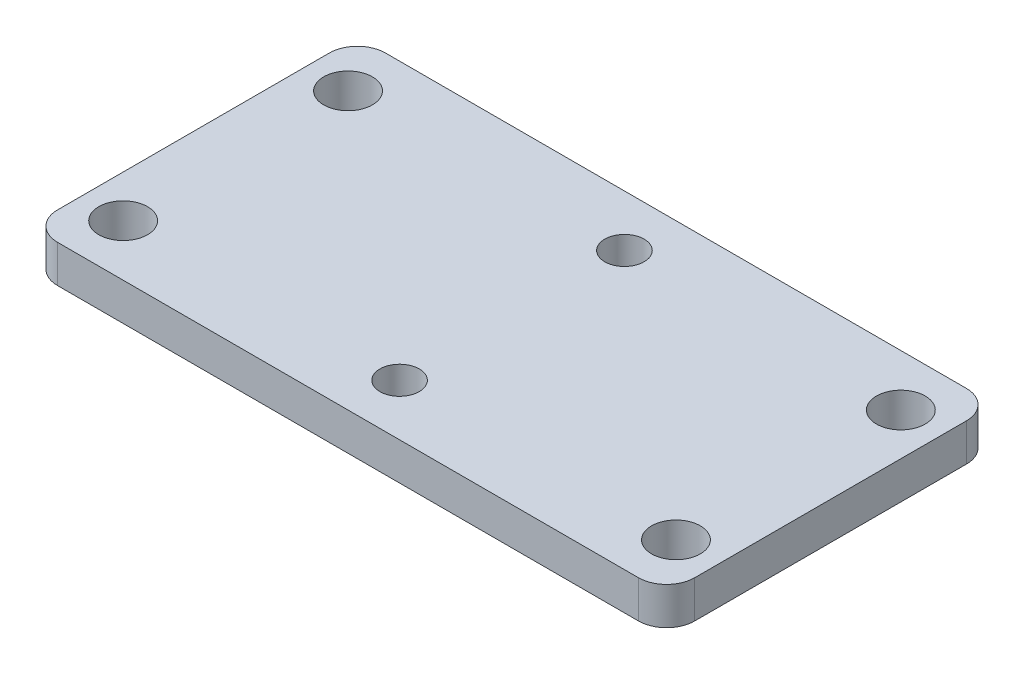
ISO-10303-21;
HEADER;
FILE_DESCRIPTION(('STEP AP214'),'2;1');
FILE_NAME('part.step','',(''),(''),'','','');
FILE_SCHEMA(('AUTOMOTIVE_DESIGN { 1 0 10303 214 1 1 1 1 }'));
ENDSEC;
DATA;
#1=APPLICATION_CONTEXT('core data for automotive mechanical design processes');
#2=APPLICATION_PROTOCOL_DEFINITION('international standard','automotive_design',2000,#1);
#3=PRODUCT_CONTEXT('',#1,'mechanical');
#4=PRODUCT('Part','Part','',(#3));
#5=PRODUCT_RELATED_PRODUCT_CATEGORY('part','',(#4));
#6=PRODUCT_DEFINITION_FORMATION('','',#4);
#7=PRODUCT_DEFINITION_CONTEXT('part definition',#1,'design');
#8=PRODUCT_DEFINITION('design','',#6,#7);
#9=PRODUCT_DEFINITION_SHAPE('','',#8);
#10=(LENGTH_UNIT() NAMED_UNIT(*) SI_UNIT(.MILLI.,.METRE.));
#11=(NAMED_UNIT(*) PLANE_ANGLE_UNIT() SI_UNIT($,.RADIAN.));
#12=(NAMED_UNIT(*) SI_UNIT($,.STERADIAN.) SOLID_ANGLE_UNIT());
#13=UNCERTAINTY_MEASURE_WITH_UNIT(LENGTH_MEASURE(1.E-05),#10,'distance_accuracy_value','');
#14=(GEOMETRIC_REPRESENTATION_CONTEXT(3) GLOBAL_UNCERTAINTY_ASSIGNED_CONTEXT((#13)) GLOBAL_UNIT_ASSIGNED_CONTEXT((#10,
#11,#12)) REPRESENTATION_CONTEXT('',''));
#15=CARTESIAN_POINT('',(0.,0.,0.));
#16=DIRECTION('',(0.,0.,1.));
#17=DIRECTION('',(1.,0.,0.));
#18=AXIS2_PLACEMENT_3D('',#15,#16,#17);
#19=CARTESIAN_POINT('',(34.,4.,17.5));
#20=DIRECTION('',(-1.,0.,0.));
#21=DIRECTION('',(0.,0.,1.));
#22=AXIS2_PLACEMENT_3D('',#19,#20,#21);
#23=PLANE('',#22);
#24=DIRECTION('',(0.,0.,-1.));
#25=VECTOR('',#24,1.);
#26=CARTESIAN_POINT('',(34.,4.,17.5));
#27=LINE('',#26,#25);
#28=CARTESIAN_POINT('',(34.,4.,14.5));
#29=VERTEX_POINT('',#28);
#30=CARTESIAN_POINT('',(34.,4.,-14.5));
#31=VERTEX_POINT('',#30);
#32=EDGE_CURVE('E127',#29,#31,#27,.T.);
#33=ORIENTED_EDGE('',*,*,#32,.F.);
#34=DIRECTION('',(0.,-1.,0.));
#35=VECTOR('',#34,1.);
#36=CARTESIAN_POINT('',(34.,4.,14.5));
#37=LINE('',#36,#35);
#38=CARTESIAN_POINT('',(34.,0.,14.5));
#39=VERTEX_POINT('',#38);
#40=EDGE_CURVE('E112',#29,#39,#37,.T.);
#41=ORIENTED_EDGE('',*,*,#40,.T.);
#42=DIRECTION('',(0.,0.,-1.));
#43=VECTOR('',#42,1.);
#44=CARTESIAN_POINT('',(34.,0.,17.5));
#45=LINE('',#44,#43);
#46=CARTESIAN_POINT('',(34.,0.,-14.5));
#47=VERTEX_POINT('',#46);
#48=EDGE_CURVE('E124',#39,#47,#45,.T.);
#49=ORIENTED_EDGE('',*,*,#48,.T.);
#50=DIRECTION('',(0.,-1.,0.));
#51=VECTOR('',#50,1.);
#52=CARTESIAN_POINT('',(34.,4.,-14.5));
#53=LINE('',#52,#51);
#54=EDGE_CURVE('E129',#47,#31,#53,.F.);
#55=ORIENTED_EDGE('',*,*,#54,.T.);
#56=EDGE_LOOP('',(#33,#41,#49,#55));
#57=FACE_BOUND('',#56,.T.);
#58=ADVANCED_FACE('F43',(#57),#23,.F.);
#59=CARTESIAN_POINT('',(-34.,4.,-17.5));
#60=DIRECTION('',(0.,0.,1.));
#61=DIRECTION('',(1.,0.,0.));
#62=AXIS2_PLACEMENT_3D('',#59,#60,#61);
#63=PLANE('',#62);
#64=DIRECTION('',(-1.,0.,0.));
#65=VECTOR('',#64,1.);
#66=CARTESIAN_POINT('',(-34.,4.,-17.5));
#67=LINE('',#66,#65);
#68=CARTESIAN_POINT('',(31.,4.,-17.5));
#69=VERTEX_POINT('',#68);
#70=CARTESIAN_POINT('',(-31.,4.,-17.5));
#71=VERTEX_POINT('',#70);
#72=EDGE_CURVE('E182',#69,#71,#67,.T.);
#73=ORIENTED_EDGE('',*,*,#72,.F.);
#74=DIRECTION('',(0.,-1.,0.));
#75=VECTOR('',#74,1.);
#76=CARTESIAN_POINT('',(31.,4.,-17.5));
#77=LINE('',#76,#75);
#78=CARTESIAN_POINT('',(31.,0.,-17.5));
#79=VERTEX_POINT('',#78);
#80=EDGE_CURVE('E166',#69,#79,#77,.T.);
#81=ORIENTED_EDGE('',*,*,#80,.T.);
#82=DIRECTION('',(-1.,0.,0.));
#83=VECTOR('',#82,1.);
#84=CARTESIAN_POINT('',(-34.,0.,-17.5));
#85=LINE('',#84,#83);
#86=CARTESIAN_POINT('',(-31.,0.,-17.5));
#87=VERTEX_POINT('',#86);
#88=EDGE_CURVE('E133',#79,#87,#85,.T.);
#89=ORIENTED_EDGE('',*,*,#88,.T.);
#90=DIRECTION('',(0.,-1.,0.));
#91=VECTOR('',#90,1.);
#92=CARTESIAN_POINT('',(-31.,4.,-17.5));
#93=LINE('',#92,#91);
#94=EDGE_CURVE('E164',#87,#71,#93,.F.);
#95=ORIENTED_EDGE('',*,*,#94,.T.);
#96=EDGE_LOOP('',(#73,#81,#89,#95));
#97=FACE_BOUND('',#96,.T.);
#98=ADVANCED_FACE('F244',(#97),#63,.F.);
#99=CARTESIAN_POINT('',(-34.,4.,17.5));
#100=DIRECTION('',(1.,0.,0.));
#101=DIRECTION('',(0.,0.,-1.));
#102=AXIS2_PLACEMENT_3D('',#99,#100,#101);
#103=PLANE('',#102);
#104=DIRECTION('',(0.,0.,1.));
#105=VECTOR('',#104,1.);
#106=CARTESIAN_POINT('',(-34.,0.,17.5));
#107=LINE('',#106,#105);
#108=CARTESIAN_POINT('',(-34.,0.,-14.5));
#109=VERTEX_POINT('',#108);
#110=CARTESIAN_POINT('',(-34.,0.,14.5));
#111=VERTEX_POINT('',#110);
#112=EDGE_CURVE('E137',#109,#111,#107,.T.);
#113=ORIENTED_EDGE('',*,*,#112,.T.);
#114=DIRECTION('',(0.,-1.,0.));
#115=VECTOR('',#114,1.);
#116=CARTESIAN_POINT('',(-34.,4.,14.5));
#117=LINE('',#116,#115);
#118=CARTESIAN_POINT('',(-34.,4.,14.5));
#119=VERTEX_POINT('',#118);
#120=EDGE_CURVE('E11',#111,#119,#117,.F.);
#121=ORIENTED_EDGE('',*,*,#120,.T.);
#122=DIRECTION('',(0.,0.,1.));
#123=VECTOR('',#122,1.);
#124=CARTESIAN_POINT('',(-34.,4.,17.5));
#125=LINE('',#124,#123);
#126=CARTESIAN_POINT('',(-34.,4.,-14.5));
#127=VERTEX_POINT('',#126);
#128=EDGE_CURVE('E172',#127,#119,#125,.T.);
#129=ORIENTED_EDGE('',*,*,#128,.F.);
#130=DIRECTION('',(0.,-1.,0.));
#131=VECTOR('',#130,1.);
#132=CARTESIAN_POINT('',(-34.,4.,-14.5));
#133=LINE('',#132,#131);
#134=EDGE_CURVE('E51',#127,#109,#133,.T.);
#135=ORIENTED_EDGE('',*,*,#134,.T.);
#136=EDGE_LOOP('',(#113,#121,#129,#135));
#137=FACE_BOUND('',#136,.T.);
#138=ADVANCED_FACE('F171',(#137),#103,.F.);
#139=CARTESIAN_POINT('',(-34.,4.,17.5));
#140=DIRECTION('',(0.,0.,-1.));
#141=DIRECTION('',(-1.,0.,0.));
#142=AXIS2_PLACEMENT_3D('',#139,#140,#141);
#143=PLANE('',#142);
#144=DIRECTION('',(1.,0.,0.));
#145=VECTOR('',#144,1.);
#146=CARTESIAN_POINT('',(-34.,0.,17.5));
#147=LINE('',#146,#145);
#148=CARTESIAN_POINT('',(-31.,0.,17.5));
#149=VERTEX_POINT('',#148);
#150=CARTESIAN_POINT('',(31.,0.,17.5));
#151=VERTEX_POINT('',#150);
#152=EDGE_CURVE('E147',#149,#151,#147,.T.);
#153=ORIENTED_EDGE('',*,*,#152,.T.);
#154=DIRECTION('',(0.,-1.,0.));
#155=VECTOR('',#154,1.);
#156=CARTESIAN_POINT('',(31.,4.,17.5));
#157=LINE('',#156,#155);
#158=CARTESIAN_POINT('',(31.,4.,17.5));
#159=VERTEX_POINT('',#158);
#160=EDGE_CURVE('E113',#151,#159,#157,.F.);
#161=ORIENTED_EDGE('',*,*,#160,.T.);
#162=DIRECTION('',(1.,0.,0.));
#163=VECTOR('',#162,1.);
#164=CARTESIAN_POINT('',(-34.,4.,17.5));
#165=LINE('',#164,#163);
#166=CARTESIAN_POINT('',(-31.,4.,17.5));
#167=VERTEX_POINT('',#166);
#168=EDGE_CURVE('E143',#167,#159,#165,.T.);
#169=ORIENTED_EDGE('',*,*,#168,.F.);
#170=DIRECTION('',(0.,-1.,0.));
#171=VECTOR('',#170,1.);
#172=CARTESIAN_POINT('',(-31.,4.,17.5));
#173=LINE('',#172,#171);
#174=EDGE_CURVE('E118',#167,#149,#173,.T.);
#175=ORIENTED_EDGE('',*,*,#174,.T.);
#176=EDGE_LOOP('',(#153,#161,#169,#175));
#177=FACE_BOUND('',#176,.T.);
#178=ADVANCED_FACE('F180',(#177),#143,.F.);
#179=CARTESIAN_POINT('',(0.,4.,0.));
#180=DIRECTION('',(0.,-1.,0.));
#181=DIRECTION('',(0.,0.,-1.));
#182=AXIS2_PLACEMENT_3D('',#179,#180,#181);
#183=PLANE('',#182);
#184=CARTESIAN_POINT('',(29.5,4.,-12.));
#185=DIRECTION('',(0.,1.,0.));
#186=DIRECTION('',(0.,0.,-1.));
#187=AXIS2_PLACEMENT_3D('',#184,#185,#186);
#188=CIRCLE('',#187,2.6);
#189=CARTESIAN_POINT('',(29.5,4.,-14.6));
#190=VERTEX_POINT('',#189);
#191=EDGE_CURVE('E187',#190,#190,#188,.T.);
#192=ORIENTED_EDGE('',*,*,#191,.F.);
#193=EDGE_LOOP('',(#192));
#194=FACE_BOUND('',#193,.T.);
#195=CARTESIAN_POINT('',(29.5,4.,12.));
#196=DIRECTION('',(0.,1.,0.));
#197=DIRECTION('',(0.,0.,1.));
#198=AXIS2_PLACEMENT_3D('',#195,#196,#197);
#199=CIRCLE('',#198,2.59999999999999);
#200=CARTESIAN_POINT('',(29.5,4.,14.6));
#201=VERTEX_POINT('',#200);
#202=EDGE_CURVE('E205',#201,#201,#199,.T.);
#203=ORIENTED_EDGE('',*,*,#202,.F.);
#204=EDGE_LOOP('',(#203));
#205=FACE_BOUND('',#204,.T.);
#206=CARTESIAN_POINT('',(-29.5,4.,12.));
#207=DIRECTION('',(0.,1.,0.));
#208=DIRECTION('',(0.,0.,-1.));
#209=AXIS2_PLACEMENT_3D('',#206,#207,#208);
#210=CIRCLE('',#209,2.6);
#211=CARTESIAN_POINT('',(-29.5,4.,9.40000000000001));
#212=VERTEX_POINT('',#211);
#213=EDGE_CURVE('E199',#212,#212,#210,.T.);
#214=ORIENTED_EDGE('',*,*,#213,.F.);
#215=EDGE_LOOP('',(#214));
#216=FACE_BOUND('',#215,.T.);
#217=CARTESIAN_POINT('',(0.,4.,-12.));
#218=DIRECTION('',(0.,1.,0.));
#219=DIRECTION('',(0.,0.,1.));
#220=AXIS2_PLACEMENT_3D('',#217,#218,#219);
#221=CIRCLE('',#220,2.1);
#222=CARTESIAN_POINT('',(0.,4.,-9.9));
#223=VERTEX_POINT('',#222);
#224=EDGE_CURVE('E192',#223,#223,#221,.T.);
#225=ORIENTED_EDGE('',*,*,#224,.F.);
#226=EDGE_LOOP('',(#225));
#227=FACE_BOUND('',#226,.T.);
#228=CARTESIAN_POINT('',(0.,4.,12.));
#229=DIRECTION('',(0.,1.,0.));
#230=DIRECTION('',(0.,0.,-1.));
#231=AXIS2_PLACEMENT_3D('',#228,#229,#230);
#232=CIRCLE('',#231,2.1);
#233=CARTESIAN_POINT('',(0.,4.,9.9));
#234=VERTEX_POINT('',#233);
#235=EDGE_CURVE('E193',#234,#234,#232,.T.);
#236=ORIENTED_EDGE('',*,*,#235,.F.);
#237=EDGE_LOOP('',(#236));
#238=FACE_BOUND('',#237,.T.);
#239=CARTESIAN_POINT('',(-29.5,4.,-12.));
#240=DIRECTION('',(0.,1.,0.));
#241=DIRECTION('',(0.,0.,1.));
#242=AXIS2_PLACEMENT_3D('',#239,#240,#241);
#243=CIRCLE('',#242,2.6);
#244=CARTESIAN_POINT('',(-29.5,4.,-9.4));
#245=VERTEX_POINT('',#244);
#246=EDGE_CURVE('E140',#245,#245,#243,.T.);
#247=ORIENTED_EDGE('',*,*,#246,.F.);
#248=EDGE_LOOP('',(#247));
#249=FACE_BOUND('',#248,.T.);
#250=ORIENTED_EDGE('',*,*,#168,.T.);
#251=CARTESIAN_POINT('',(31.,4.,14.5));
#252=DIRECTION('',(0.,-1.,0.));
#253=DIRECTION('',(0.,0.,-1.));
#254=AXIS2_PLACEMENT_3D('',#251,#252,#253);
#255=CIRCLE('',#254,3.);
#256=EDGE_CURVE('E162',#159,#29,#255,.F.);
#257=ORIENTED_EDGE('',*,*,#256,.T.);
#258=ORIENTED_EDGE('',*,*,#32,.T.);
#259=CARTESIAN_POINT('',(31.,4.,-14.5));
#260=DIRECTION('',(0.,-1.,0.));
#261=DIRECTION('',(0.,0.,-1.));
#262=AXIS2_PLACEMENT_3D('',#259,#260,#261);
#263=CIRCLE('',#262,3.);
#264=EDGE_CURVE('E160',#31,#69,#263,.F.);
#265=ORIENTED_EDGE('',*,*,#264,.T.);
#266=ORIENTED_EDGE('',*,*,#72,.T.);
#267=CARTESIAN_POINT('',(-31.,4.,-14.5));
#268=DIRECTION('',(0.,-1.,0.));
#269=DIRECTION('',(0.,0.,-1.));
#270=AXIS2_PLACEMENT_3D('',#267,#268,#269);
#271=CIRCLE('',#270,3.);
#272=EDGE_CURVE('E63',#71,#127,#271,.F.);
#273=ORIENTED_EDGE('',*,*,#272,.T.);
#274=ORIENTED_EDGE('',*,*,#128,.T.);
#275=CARTESIAN_POINT('',(-31.,4.,14.5));
#276=DIRECTION('',(0.,-1.,0.));
#277=DIRECTION('',(0.,0.,-1.));
#278=AXIS2_PLACEMENT_3D('',#275,#276,#277);
#279=CIRCLE('',#278,3.);
#280=EDGE_CURVE('E158',#119,#167,#279,.F.);
#281=ORIENTED_EDGE('',*,*,#280,.T.);
#282=EDGE_LOOP('',(#250,#257,#258,#265,#266,#273,#274,#281));
#283=FACE_BOUND('',#282,.T.);
#284=ADVANCED_FACE('F221',(#194,#205,#216,#227,#238,#249,#283),#183,.F.);
#285=CARTESIAN_POINT('',(0.,0.,0.));
#286=DIRECTION('',(0.,-1.,0.));
#287=DIRECTION('',(0.,0.,-1.));
#288=AXIS2_PLACEMENT_3D('',#285,#286,#287);
#289=PLANE('',#288);
#290=CARTESIAN_POINT('',(29.5,0.,-12.));
#291=DIRECTION('',(0.,1.,0.));
#292=DIRECTION('',(0.,0.,-1.));
#293=AXIS2_PLACEMENT_3D('',#290,#291,#292);
#294=CIRCLE('',#293,2.6);
#295=CARTESIAN_POINT('',(29.5,0.,-14.6));
#296=VERTEX_POINT('',#295);
#297=EDGE_CURVE('E208',#296,#296,#294,.T.);
#298=ORIENTED_EDGE('',*,*,#297,.T.);
#299=EDGE_LOOP('',(#298));
#300=FACE_BOUND('',#299,.T.);
#301=CARTESIAN_POINT('',(29.5,0.,12.));
#302=DIRECTION('',(0.,1.,0.));
#303=DIRECTION('',(0.,0.,1.));
#304=AXIS2_PLACEMENT_3D('',#301,#302,#303);
#305=CIRCLE('',#304,2.59999999999999);
#306=CARTESIAN_POINT('',(29.5,0.,14.6));
#307=VERTEX_POINT('',#306);
#308=EDGE_CURVE('E202',#307,#307,#305,.T.);
#309=ORIENTED_EDGE('',*,*,#308,.T.);
#310=EDGE_LOOP('',(#309));
#311=FACE_BOUND('',#310,.T.);
#312=CARTESIAN_POINT('',(-29.5,0.,12.));
#313=DIRECTION('',(0.,1.,0.));
#314=DIRECTION('',(0.,0.,-1.));
#315=AXIS2_PLACEMENT_3D('',#312,#313,#314);
#316=CIRCLE('',#315,2.6);
#317=CARTESIAN_POINT('',(-29.5,0.,9.40000000000001));
#318=VERTEX_POINT('',#317);
#319=EDGE_CURVE('E196',#318,#318,#316,.T.);
#320=ORIENTED_EDGE('',*,*,#319,.T.);
#321=EDGE_LOOP('',(#320));
#322=FACE_BOUND('',#321,.T.);
#323=CARTESIAN_POINT('',(0.,0.,-12.));
#324=DIRECTION('',(0.,1.,0.));
#325=DIRECTION('',(0.,0.,1.));
#326=AXIS2_PLACEMENT_3D('',#323,#324,#325);
#327=CIRCLE('',#326,2.1);
#328=CARTESIAN_POINT('',(0.,0.,-9.9));
#329=VERTEX_POINT('',#328);
#330=EDGE_CURVE('E189',#329,#329,#327,.T.);
#331=ORIENTED_EDGE('',*,*,#330,.T.);
#332=EDGE_LOOP('',(#331));
#333=FACE_BOUND('',#332,.T.);
#334=CARTESIAN_POINT('',(0.,0.,12.));
#335=DIRECTION('',(0.,1.,0.));
#336=DIRECTION('',(0.,0.,-1.));
#337=AXIS2_PLACEMENT_3D('',#334,#335,#336);
#338=CIRCLE('',#337,2.1);
#339=CARTESIAN_POINT('',(0.,0.,9.9));
#340=VERTEX_POINT('',#339);
#341=EDGE_CURVE('E213',#340,#340,#338,.T.);
#342=ORIENTED_EDGE('',*,*,#341,.T.);
#343=EDGE_LOOP('',(#342));
#344=FACE_BOUND('',#343,.T.);
#345=CARTESIAN_POINT('',(-29.5,0.,-12.));
#346=DIRECTION('',(0.,1.,0.));
#347=DIRECTION('',(0.,0.,1.));
#348=AXIS2_PLACEMENT_3D('',#345,#346,#347);
#349=CIRCLE('',#348,2.6);
#350=CARTESIAN_POINT('',(-29.5,0.,-9.4));
#351=VERTEX_POINT('',#350);
#352=EDGE_CURVE('E134',#351,#351,#349,.T.);
#353=ORIENTED_EDGE('',*,*,#352,.T.);
#354=EDGE_LOOP('',(#353));
#355=FACE_BOUND('',#354,.T.);
#356=ORIENTED_EDGE('',*,*,#48,.F.);
#357=CARTESIAN_POINT('',(31.,0.,14.5));
#358=DIRECTION('',(0.,-1.,0.));
#359=DIRECTION('',(0.,0.,-1.));
#360=AXIS2_PLACEMENT_3D('',#357,#358,#359);
#361=CIRCLE('',#360,3.);
#362=EDGE_CURVE('E108',#39,#151,#361,.T.);
#363=ORIENTED_EDGE('',*,*,#362,.T.);
#364=ORIENTED_EDGE('',*,*,#152,.F.);
#365=CARTESIAN_POINT('',(-31.,0.,14.5));
#366=DIRECTION('',(0.,-1.,0.));
#367=DIRECTION('',(0.,0.,-1.));
#368=AXIS2_PLACEMENT_3D('',#365,#366,#367);
#369=CIRCLE('',#368,3.);
#370=EDGE_CURVE('E151',#149,#111,#369,.T.);
#371=ORIENTED_EDGE('',*,*,#370,.T.);
#372=ORIENTED_EDGE('',*,*,#112,.F.);
#373=CARTESIAN_POINT('',(-31.,0.,-14.5));
#374=DIRECTION('',(0.,-1.,0.));
#375=DIRECTION('',(0.,0.,-1.));
#376=AXIS2_PLACEMENT_3D('',#373,#374,#375);
#377=CIRCLE('',#376,3.);
#378=EDGE_CURVE('E128',#109,#87,#377,.T.);
#379=ORIENTED_EDGE('',*,*,#378,.T.);
#380=ORIENTED_EDGE('',*,*,#88,.F.);
#381=CARTESIAN_POINT('',(31.,0.,-14.5));
#382=DIRECTION('',(0.,-1.,0.));
#383=DIRECTION('',(0.,0.,-1.));
#384=AXIS2_PLACEMENT_3D('',#381,#382,#383);
#385=CIRCLE('',#384,3.);
#386=EDGE_CURVE('E119',#79,#47,#385,.T.);
#387=ORIENTED_EDGE('',*,*,#386,.T.);
#388=EDGE_LOOP('',(#356,#363,#364,#371,#372,#379,#380,#387));
#389=FACE_BOUND('',#388,.T.);
#390=ADVANCED_FACE('F131',(#300,#311,#322,#333,#344,#355,#389),#289,.T.);
#391=CARTESIAN_POINT('',(-29.5,0.,-12.));
#392=DIRECTION('',(0.,1.,0.));
#393=DIRECTION('',(0.,0.,1.));
#394=AXIS2_PLACEMENT_3D('',#391,#392,#393);
#395=CYLINDRICAL_SURFACE('',#394,2.6);
#396=ORIENTED_EDGE('',*,*,#352,.F.);
#397=EDGE_LOOP('',(#396));
#398=FACE_BOUND('',#397,.T.);
#399=ORIENTED_EDGE('',*,*,#246,.T.);
#400=EDGE_LOOP('',(#399));
#401=FACE_BOUND('',#400,.T.);
#402=ADVANCED_FACE('F228',(#398,#401),#395,.F.);
#403=CARTESIAN_POINT('',(0.,0.,12.));
#404=DIRECTION('',(0.,1.,0.));
#405=DIRECTION('',(0.,0.,1.));
#406=AXIS2_PLACEMENT_3D('',#403,#404,#405);
#407=CYLINDRICAL_SURFACE('',#406,2.1);
#408=ORIENTED_EDGE('',*,*,#341,.F.);
#409=EDGE_LOOP('',(#408));
#410=FACE_BOUND('',#409,.T.);
#411=ORIENTED_EDGE('',*,*,#235,.T.);
#412=EDGE_LOOP('',(#411));
#413=FACE_BOUND('',#412,.T.);
#414=ADVANCED_FACE('F219',(#410,#413),#407,.F.);
#415=CARTESIAN_POINT('',(0.,0.,-12.));
#416=DIRECTION('',(0.,1.,0.));
#417=DIRECTION('',(0.,0.,1.));
#418=AXIS2_PLACEMENT_3D('',#415,#416,#417);
#419=CYLINDRICAL_SURFACE('',#418,2.1);
#420=ORIENTED_EDGE('',*,*,#330,.F.);
#421=EDGE_LOOP('',(#420));
#422=FACE_BOUND('',#421,.T.);
#423=ORIENTED_EDGE('',*,*,#224,.T.);
#424=EDGE_LOOP('',(#423));
#425=FACE_BOUND('',#424,.T.);
#426=ADVANCED_FACE('F235',(#422,#425),#419,.F.);
#427=CARTESIAN_POINT('',(-29.5,0.,12.));
#428=DIRECTION('',(0.,1.,0.));
#429=DIRECTION('',(0.,0.,1.));
#430=AXIS2_PLACEMENT_3D('',#427,#428,#429);
#431=CYLINDRICAL_SURFACE('',#430,2.6);
#432=ORIENTED_EDGE('',*,*,#319,.F.);
#433=EDGE_LOOP('',(#432));
#434=FACE_BOUND('',#433,.T.);
#435=ORIENTED_EDGE('',*,*,#213,.T.);
#436=EDGE_LOOP('',(#435));
#437=FACE_BOUND('',#436,.T.);
#438=ADVANCED_FACE('F305',(#434,#437),#431,.F.);
#439=CARTESIAN_POINT('',(29.5,0.,12.));
#440=DIRECTION('',(0.,1.,0.));
#441=DIRECTION('',(0.,0.,1.));
#442=AXIS2_PLACEMENT_3D('',#439,#440,#441);
#443=CYLINDRICAL_SURFACE('',#442,2.59999999999999);
#444=ORIENTED_EDGE('',*,*,#308,.F.);
#445=EDGE_LOOP('',(#444));
#446=FACE_BOUND('',#445,.T.);
#447=ORIENTED_EDGE('',*,*,#202,.T.);
#448=EDGE_LOOP('',(#447));
#449=FACE_BOUND('',#448,.T.);
#450=ADVANCED_FACE('F295',(#446,#449),#443,.F.);
#451=CARTESIAN_POINT('',(29.5,0.,-12.));
#452=DIRECTION('',(0.,1.,0.));
#453=DIRECTION('',(0.,0.,1.));
#454=AXIS2_PLACEMENT_3D('',#451,#452,#453);
#455=CYLINDRICAL_SURFACE('',#454,2.6);
#456=ORIENTED_EDGE('',*,*,#297,.F.);
#457=EDGE_LOOP('',(#456));
#458=FACE_BOUND('',#457,.T.);
#459=ORIENTED_EDGE('',*,*,#191,.T.);
#460=EDGE_LOOP('',(#459));
#461=FACE_BOUND('',#460,.T.);
#462=ADVANCED_FACE('F257',(#458,#461),#455,.F.);
#463=CARTESIAN_POINT('',(31.,4.,14.5));
#464=DIRECTION('',(0.,-1.,0.));
#465=DIRECTION('',(0.,0.,-1.));
#466=AXIS2_PLACEMENT_3D('',#463,#464,#465);
#467=CYLINDRICAL_SURFACE('',#466,3.);
#468=ORIENTED_EDGE('',*,*,#256,.F.);
#469=ORIENTED_EDGE('',*,*,#160,.F.);
#470=ORIENTED_EDGE('',*,*,#362,.F.);
#471=ORIENTED_EDGE('',*,*,#40,.F.);
#472=EDGE_LOOP('',(#468,#469,#470,#471));
#473=FACE_BOUND('',#472,.T.);
#474=ADVANCED_FACE('F111',(#473),#467,.T.);
#475=CARTESIAN_POINT('',(31.,4.,-14.5));
#476=DIRECTION('',(0.,-1.,0.));
#477=DIRECTION('',(0.,0.,-1.));
#478=AXIS2_PLACEMENT_3D('',#475,#476,#477);
#479=CYLINDRICAL_SURFACE('',#478,3.);
#480=ORIENTED_EDGE('',*,*,#264,.F.);
#481=ORIENTED_EDGE('',*,*,#54,.F.);
#482=ORIENTED_EDGE('',*,*,#386,.F.);
#483=ORIENTED_EDGE('',*,*,#80,.F.);
#484=EDGE_LOOP('',(#480,#481,#482,#483));
#485=FACE_BOUND('',#484,.T.);
#486=ADVANCED_FACE('F256',(#485),#479,.T.);
#487=CARTESIAN_POINT('',(-31.,4.,14.5));
#488=DIRECTION('',(0.,-1.,0.));
#489=DIRECTION('',(0.,0.,-1.));
#490=AXIS2_PLACEMENT_3D('',#487,#488,#489);
#491=CYLINDRICAL_SURFACE('',#490,3.);
#492=ORIENTED_EDGE('',*,*,#280,.F.);
#493=ORIENTED_EDGE('',*,*,#120,.F.);
#494=ORIENTED_EDGE('',*,*,#370,.F.);
#495=ORIENTED_EDGE('',*,*,#174,.F.);
#496=EDGE_LOOP('',(#492,#493,#494,#495));
#497=FACE_BOUND('',#496,.T.);
#498=ADVANCED_FACE('F177',(#497),#491,.T.);
#499=CARTESIAN_POINT('',(-31.,4.,-14.5));
#500=DIRECTION('',(0.,-1.,0.));
#501=DIRECTION('',(0.,0.,-1.));
#502=AXIS2_PLACEMENT_3D('',#499,#500,#501);
#503=CYLINDRICAL_SURFACE('',#502,3.);
#504=ORIENTED_EDGE('',*,*,#272,.F.);
#505=ORIENTED_EDGE('',*,*,#94,.F.);
#506=ORIENTED_EDGE('',*,*,#378,.F.);
#507=ORIENTED_EDGE('',*,*,#134,.F.);
#508=EDGE_LOOP('',(#504,#505,#506,#507));
#509=FACE_BOUND('',#508,.T.);
#510=ADVANCED_FACE('F45',(#509),#503,.T.);
#511=CLOSED_SHELL('',(#58,#98,#138,#178,#284,#390,#402,#414,#426,#438,#450,#462,#474,#486,#498,#510));
#512=MANIFOLD_SOLID_BREP('B2',#511);
#513=ADVANCED_BREP_SHAPE_REPRESENTATION('',(#18,#512),#14);
#514=SHAPE_DEFINITION_REPRESENTATION(#9,#513);
ENDSEC;
END-ISO-10303-21;
